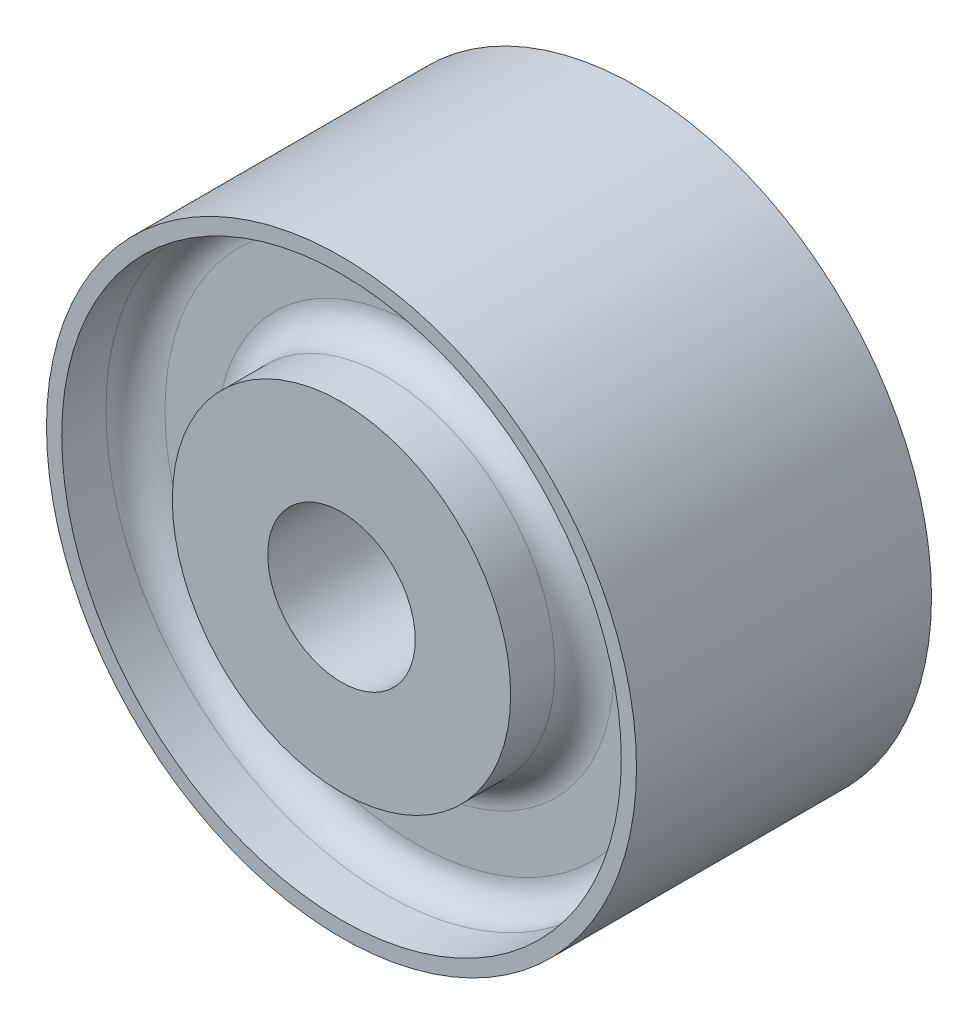
ISO-10303-21;
HEADER;
FILE_DESCRIPTION(('STEP AP214'),'2;1');
FILE_NAME('part.step','',(''),(''),'','','');
FILE_SCHEMA(('AUTOMOTIVE_DESIGN { 1 0 10303 214 1 1 1 1 }'));
ENDSEC;
DATA;
#1=APPLICATION_CONTEXT('core data for automotive mechanical design processes');
#2=APPLICATION_PROTOCOL_DEFINITION('international standard','automotive_design',2000,#1);
#3=PRODUCT_CONTEXT('',#1,'mechanical');
#4=PRODUCT('Part','Part','',(#3));
#5=PRODUCT_RELATED_PRODUCT_CATEGORY('part','',(#4));
#6=PRODUCT_DEFINITION_FORMATION('','',#4);
#7=PRODUCT_DEFINITION_CONTEXT('part definition',#1,'design');
#8=PRODUCT_DEFINITION('design','',#6,#7);
#9=PRODUCT_DEFINITION_SHAPE('','',#8);
#10=(LENGTH_UNIT() NAMED_UNIT(*) SI_UNIT(.MILLI.,.METRE.));
#11=(NAMED_UNIT(*) PLANE_ANGLE_UNIT() SI_UNIT($,.RADIAN.));
#12=(NAMED_UNIT(*) SI_UNIT($,.STERADIAN.) SOLID_ANGLE_UNIT());
#13=UNCERTAINTY_MEASURE_WITH_UNIT(LENGTH_MEASURE(1.E-05),#10,'distance_accuracy_value','');
#14=(GEOMETRIC_REPRESENTATION_CONTEXT(3) GLOBAL_UNCERTAINTY_ASSIGNED_CONTEXT((#13)) GLOBAL_UNIT_ASSIGNED_CONTEXT((#10,
#11,#12)) REPRESENTATION_CONTEXT('',''));
#15=CARTESIAN_POINT('',(0.,0.,0.));
#16=DIRECTION('',(0.,0.,1.));
#17=DIRECTION('',(1.,0.,0.));
#18=AXIS2_PLACEMENT_3D('',#15,#16,#17);
#19=CARTESIAN_POINT('',(0.,0.,-25.4));
#20=DIRECTION('',(0.,0.,1.));
#21=DIRECTION('',(1.,0.,0.));
#22=AXIS2_PLACEMENT_3D('',#19,#20,#21);
#23=PLANE('',#22);
#24=CARTESIAN_POINT('',(0.,0.,-25.4));
#25=DIRECTION('',(0.,0.,1.));
#26=DIRECTION('',(1.,0.,0.));
#27=AXIS2_PLACEMENT_3D('',#24,#25,#26);
#28=CIRCLE('',#27,50.8);
#29=CARTESIAN_POINT('',(50.8,0.,-25.4));
#30=VERTEX_POINT('',#29);
#31=EDGE_CURVE('E13',#30,#30,#28,.T.);
#32=ORIENTED_EDGE('',*,*,#31,.F.);
#33=EDGE_LOOP('',(#32));
#34=FACE_BOUND('',#33,.T.);
#35=CARTESIAN_POINT('',(0.,0.,-25.4));
#36=DIRECTION('',(0.,0.,1.));
#37=DIRECTION('',(0.,1.,0.));
#38=AXIS2_PLACEMENT_3D('',#35,#36,#37);
#39=CIRCLE('',#38,48.1770384947228);
#40=CARTESIAN_POINT('',(0.,48.1770384947228,-25.4));
#41=VERTEX_POINT('',#40);
#42=EDGE_CURVE('E106',#41,#41,#39,.T.);
#43=ORIENTED_EDGE('',*,*,#42,.T.);
#44=EDGE_LOOP('',(#43));
#45=FACE_BOUND('',#44,.T.);
#46=ADVANCED_FACE('F50',(#34,#45),#23,.F.);
#47=CARTESIAN_POINT('',(0.,0.,-25.4));
#48=DIRECTION('',(0.,0.,1.));
#49=DIRECTION('',(1.,0.,0.));
#50=AXIS2_PLACEMENT_3D('',#47,#48,#49);
#51=CIRCLE('',#50,12.7);
#52=CARTESIAN_POINT('',(12.7,0.,-25.4));
#53=VERTEX_POINT('',#52);
#54=EDGE_CURVE('E178',#53,#53,#51,.T.);
#55=ORIENTED_EDGE('',*,*,#54,.T.);
#56=EDGE_LOOP('',(#55));
#57=FACE_BOUND('',#56,.T.);
#58=CARTESIAN_POINT('',(0.,0.,-25.4));
#59=DIRECTION('',(0.,0.,1.));
#60=DIRECTION('',(0.,1.,0.));
#61=AXIS2_PLACEMENT_3D('',#58,#59,#60);
#62=CIRCLE('',#61,29.1270384947228);
#63=CARTESIAN_POINT('',(0.,29.1270384947228,-25.4));
#64=VERTEX_POINT('',#63);
#65=EDGE_CURVE('E115',#64,#64,#62,.T.);
#66=ORIENTED_EDGE('',*,*,#65,.F.);
#67=EDGE_LOOP('',(#66));
#68=FACE_BOUND('',#67,.T.);
#69=ADVANCED_FACE('F201',(#57,#68),#23,.F.);
#70=CARTESIAN_POINT('',(0.,0.,25.4));
#71=DIRECTION('',(0.,0.,1.));
#72=DIRECTION('',(1.,0.,0.));
#73=AXIS2_PLACEMENT_3D('',#70,#71,#72);
#74=PLANE('',#73);
#75=CARTESIAN_POINT('',(0.,0.,25.4));
#76=DIRECTION('',(0.,0.,1.));
#77=DIRECTION('',(0.,1.,0.));
#78=AXIS2_PLACEMENT_3D('',#75,#76,#77);
#79=CIRCLE('',#78,29.1270384947228);
#80=CARTESIAN_POINT('',(0.,29.1270384947228,25.4));
#81=VERTEX_POINT('',#80);
#82=EDGE_CURVE('E139',#81,#81,#79,.T.);
#83=ORIENTED_EDGE('',*,*,#82,.T.);
#84=EDGE_LOOP('',(#83));
#85=FACE_BOUND('',#84,.T.);
#86=CARTESIAN_POINT('',(0.,0.,25.4));
#87=DIRECTION('',(0.,0.,1.));
#88=DIRECTION('',(1.,0.,0.));
#89=AXIS2_PLACEMENT_3D('',#86,#87,#88);
#90=CIRCLE('',#89,12.7);
#91=CARTESIAN_POINT('',(12.7,0.,25.4));
#92=VERTEX_POINT('',#91);
#93=EDGE_CURVE('E175',#92,#92,#90,.T.);
#94=ORIENTED_EDGE('',*,*,#93,.F.);
#95=EDGE_LOOP('',(#94));
#96=FACE_BOUND('',#95,.T.);
#97=ADVANCED_FACE('F191',(#85,#96),#74,.T.);
#98=CARTESIAN_POINT('',(0.,0.,-25.4));
#99=DIRECTION('',(0.,0.,1.));
#100=DIRECTION('',(1.,0.,0.));
#101=AXIS2_PLACEMENT_3D('',#98,#99,#100);
#102=CYLINDRICAL_SURFACE('',#101,50.8);
#103=ORIENTED_EDGE('',*,*,#31,.T.);
#104=EDGE_LOOP('',(#103));
#105=FACE_BOUND('',#104,.T.);
#106=CARTESIAN_POINT('',(0.,0.,25.4));
#107=DIRECTION('',(0.,0.,1.));
#108=DIRECTION('',(1.,0.,0.));
#109=AXIS2_PLACEMENT_3D('',#106,#107,#108);
#110=CIRCLE('',#109,50.8);
#111=CARTESIAN_POINT('',(50.8,0.,25.4));
#112=VERTEX_POINT('',#111);
#113=EDGE_CURVE('E59',#112,#112,#110,.T.);
#114=ORIENTED_EDGE('',*,*,#113,.F.);
#115=EDGE_LOOP('',(#114));
#116=FACE_BOUND('',#115,.T.);
#117=ADVANCED_FACE('F52',(#105,#116),#102,.T.);
#118=CARTESIAN_POINT('',(0.,0.,25.4));
#119=DIRECTION('',(0.,0.,1.));
#120=DIRECTION('',(0.,1.,0.));
#121=AXIS2_PLACEMENT_3D('',#118,#119,#120);
#122=CIRCLE('',#121,48.1770384947228);
#123=CARTESIAN_POINT('',(0.,48.1770384947228,25.4));
#124=VERTEX_POINT('',#123);
#125=EDGE_CURVE('E144',#124,#124,#122,.T.);
#126=ORIENTED_EDGE('',*,*,#125,.F.);
#127=EDGE_LOOP('',(#126));
#128=FACE_BOUND('',#127,.T.);
#129=ORIENTED_EDGE('',*,*,#113,.T.);
#130=EDGE_LOOP('',(#129));
#131=FACE_BOUND('',#130,.T.);
#132=ADVANCED_FACE('F188',(#128,#131),#74,.T.);
#133=CARTESIAN_POINT('',(0.,0.,-25.4));
#134=DIRECTION('',(0.,0.,1.));
#135=DIRECTION('',(1.,0.,0.));
#136=AXIS2_PLACEMENT_3D('',#133,#134,#135);
#137=CYLINDRICAL_SURFACE('',#136,12.7);
#138=ORIENTED_EDGE('',*,*,#54,.F.);
#139=EDGE_LOOP('',(#138));
#140=FACE_BOUND('',#139,.T.);
#141=ORIENTED_EDGE('',*,*,#93,.T.);
#142=EDGE_LOOP('',(#141));
#143=FACE_BOUND('',#142,.T.);
#144=ADVANCED_FACE('F197',(#140,#143),#137,.F.);
#145=CARTESIAN_POINT('',(0.,0.,25.4));
#146=DIRECTION('',(0.,0.,1.));
#147=DIRECTION('',(1.,0.,0.));
#148=AXIS2_PLACEMENT_3D('',#145,#146,#147);
#149=CYLINDRICAL_SURFACE('',#148,29.1270384947228);
#150=DIRECTION('',(0.,0.,-1.));
#151=VECTOR('',#150,1.);
#152=CARTESIAN_POINT('',(0.,29.1270384947228,25.4));
#153=LINE('',#152,#151);
#154=CARTESIAN_POINT('',(0.,29.1270384947228,17.78));
#155=VERTEX_POINT('',#154);
#156=EDGE_CURVE('E136',#81,#155,#153,.T.);
#157=ORIENTED_EDGE('',*,*,#156,.F.);
#158=ORIENTED_EDGE('',*,*,#82,.F.);
#159=ORIENTED_EDGE('',*,*,#156,.T.);
#160=CARTESIAN_POINT('',(0.,0.,17.78));
#161=DIRECTION('',(0.,0.,1.));
#162=DIRECTION('',(0.,1.,0.));
#163=AXIS2_PLACEMENT_3D('',#160,#161,#162);
#164=CIRCLE('',#163,29.1270384947228);
#165=EDGE_CURVE('E143',#155,#155,#164,.T.);
#166=ORIENTED_EDGE('',*,*,#165,.T.);
#167=EDGE_LOOP('',(#157,#158,#159,#166));
#168=FACE_BOUND('',#167,.T.);
#169=ADVANCED_FACE('F215',(#168),#149,.T.);
#170=CARTESIAN_POINT('',(0.,0.,17.78));
#171=DIRECTION('',(0.,0.,1.));
#172=DIRECTION('',(1.,0.,0.));
#173=AXIS2_PLACEMENT_3D('',#170,#171,#172);
#174=TOROIDAL_SURFACE('',#173,34.2070384947228,5.08);
#175=CARTESIAN_POINT('',(0.,34.2070384947228,17.78));
#176=DIRECTION('',(1.,0.,0.));
#177=DIRECTION('',(0.,0.,1.));
#178=AXIS2_PLACEMENT_3D('',#175,#176,#177);
#179=CIRCLE('',#178,5.08);
#180=CARTESIAN_POINT('',(0.,34.2070384947228,12.7));
#181=VERTEX_POINT('',#180);
#182=EDGE_CURVE('E151',#155,#181,#179,.T.);
#183=ORIENTED_EDGE('',*,*,#182,.F.);
#184=ORIENTED_EDGE('',*,*,#165,.F.);
#185=ORIENTED_EDGE('',*,*,#182,.T.);
#186=CARTESIAN_POINT('',(0.,0.,12.7));
#187=DIRECTION('',(0.,0.,1.));
#188=DIRECTION('',(0.,1.,0.));
#189=AXIS2_PLACEMENT_3D('',#186,#187,#188);
#190=CIRCLE('',#189,34.2070384947228);
#191=EDGE_CURVE('E155',#181,#181,#190,.T.);
#192=ORIENTED_EDGE('',*,*,#191,.T.);
#193=EDGE_LOOP('',(#183,#184,#185,#192));
#194=FACE_BOUND('',#193,.T.);
#195=ADVANCED_FACE('F228',(#194),#174,.F.);
#196=CARTESIAN_POINT('',(0.,43.0970384947228,12.7));
#197=DIRECTION('',(0.,0.,1.));
#198=DIRECTION('',(1.,0.,0.));
#199=AXIS2_PLACEMENT_3D('',#196,#197,#198);
#200=PLANE('',#199);
#201=CARTESIAN_POINT('',(0.,0.,12.7));
#202=DIRECTION('',(0.,0.,1.));
#203=DIRECTION('',(0.,1.,0.));
#204=AXIS2_PLACEMENT_3D('',#201,#202,#203);
#205=CIRCLE('',#204,43.0970384947228);
#206=CARTESIAN_POINT('',(0.,43.0970384947228,12.7));
#207=VERTEX_POINT('',#206);
#208=EDGE_CURVE('E162',#207,#207,#205,.T.);
#209=ORIENTED_EDGE('',*,*,#208,.T.);
#210=EDGE_LOOP('',(#209));
#211=FACE_BOUND('',#210,.T.);
#212=ORIENTED_EDGE('',*,*,#191,.F.);
#213=EDGE_LOOP('',(#212));
#214=FACE_BOUND('',#213,.T.);
#215=ADVANCED_FACE('F224',(#211,#214),#200,.T.);
#216=CARTESIAN_POINT('',(0.,0.,17.78));
#217=DIRECTION('',(0.,0.,1.));
#218=DIRECTION('',(1.,0.,0.));
#219=AXIS2_PLACEMENT_3D('',#216,#217,#218);
#220=TOROIDAL_SURFACE('',#219,43.0970384947228,5.08);
#221=CARTESIAN_POINT('',(0.,43.0970384947228,17.78));
#222=DIRECTION('',(1.,0.,0.));
#223=DIRECTION('',(0.,0.,-1.));
#224=AXIS2_PLACEMENT_3D('',#221,#222,#223);
#225=CIRCLE('',#224,5.08);
#226=CARTESIAN_POINT('',(0.,48.1770384947228,17.78));
#227=VERTEX_POINT('',#226);
#228=EDGE_CURVE('E165',#207,#227,#225,.T.);
#229=ORIENTED_EDGE('',*,*,#228,.F.);
#230=ORIENTED_EDGE('',*,*,#208,.F.);
#231=ORIENTED_EDGE('',*,*,#228,.T.);
#232=CARTESIAN_POINT('',(0.,0.,17.78));
#233=DIRECTION('',(0.,0.,1.));
#234=DIRECTION('',(0.,1.,0.));
#235=AXIS2_PLACEMENT_3D('',#232,#233,#234);
#236=CIRCLE('',#235,48.1770384947228);
#237=EDGE_CURVE('E169',#227,#227,#236,.T.);
#238=ORIENTED_EDGE('',*,*,#237,.T.);
#239=EDGE_LOOP('',(#229,#230,#231,#238));
#240=FACE_BOUND('',#239,.T.);
#241=ADVANCED_FACE('F220',(#240),#220,.F.);
#242=CARTESIAN_POINT('',(0.,0.,25.4));
#243=DIRECTION('',(0.,0.,1.));
#244=DIRECTION('',(1.,0.,0.));
#245=AXIS2_PLACEMENT_3D('',#242,#243,#244);
#246=CYLINDRICAL_SURFACE('',#245,48.1770384947228);
#247=DIRECTION('',(0.,0.,1.));
#248=VECTOR('',#247,1.);
#249=CARTESIAN_POINT('',(0.,48.1770384947228,25.4));
#250=LINE('',#249,#248);
#251=EDGE_CURVE('E148',#227,#124,#250,.T.);
#252=ORIENTED_EDGE('',*,*,#251,.F.);
#253=ORIENTED_EDGE('',*,*,#237,.F.);
#254=ORIENTED_EDGE('',*,*,#251,.T.);
#255=ORIENTED_EDGE('',*,*,#125,.T.);
#256=EDGE_LOOP('',(#252,#253,#254,#255));
#257=FACE_BOUND('',#256,.T.);
#258=ADVANCED_FACE('F217',(#257),#246,.F.);
#259=CARTESIAN_POINT('',(0.,0.,-25.4));
#260=DIRECTION('',(0.,0.,1.));
#261=DIRECTION('',(1.,0.,0.));
#262=AXIS2_PLACEMENT_3D('',#259,#260,#261);
#263=CYLINDRICAL_SURFACE('',#262,48.1770384947228);
#264=DIRECTION('',(0.,0.,-1.));
#265=VECTOR('',#264,1.);
#266=CARTESIAN_POINT('',(0.,48.1770384947228,-25.4));
#267=LINE('',#266,#265);
#268=CARTESIAN_POINT('',(0.,48.1770384947228,-17.78));
#269=VERTEX_POINT('',#268);
#270=EDGE_CURVE('E66',#41,#269,#267,.F.);
#271=ORIENTED_EDGE('',*,*,#270,.F.);
#272=ORIENTED_EDGE('',*,*,#42,.F.);
#273=ORIENTED_EDGE('',*,*,#270,.T.);
#274=CARTESIAN_POINT('',(0.,0.,-17.78));
#275=DIRECTION('',(0.,0.,1.));
#276=DIRECTION('',(0.,1.,0.));
#277=AXIS2_PLACEMENT_3D('',#274,#275,#276);
#278=CIRCLE('',#277,48.1770384947228);
#279=EDGE_CURVE('E104',#269,#269,#278,.T.);
#280=ORIENTED_EDGE('',*,*,#279,.T.);
#281=EDGE_LOOP('',(#271,#272,#273,#280));
#282=FACE_BOUND('',#281,.T.);
#283=ADVANCED_FACE('F102',(#282),#263,.F.);
#284=CARTESIAN_POINT('',(0.,0.,-17.78));
#285=DIRECTION('',(0.,0.,1.));
#286=DIRECTION('',(1.,0.,0.));
#287=AXIS2_PLACEMENT_3D('',#284,#285,#286);
#288=TOROIDAL_SURFACE('',#287,43.0970384947228,5.08);
#289=CARTESIAN_POINT('',(0.,43.0970384947228,-17.78));
#290=DIRECTION('',(-1.,0.,0.));
#291=DIRECTION('',(0.,0.,1.));
#292=AXIS2_PLACEMENT_3D('',#289,#290,#291);
#293=CIRCLE('',#292,5.08);
#294=CARTESIAN_POINT('',(0.,43.0970384947228,-12.7));
#295=VERTEX_POINT('',#294);
#296=EDGE_CURVE('E108',#269,#295,#293,.F.);
#297=ORIENTED_EDGE('',*,*,#296,.F.);
#298=ORIENTED_EDGE('',*,*,#279,.F.);
#299=ORIENTED_EDGE('',*,*,#296,.T.);
#300=CARTESIAN_POINT('',(0.,0.,-12.7));
#301=DIRECTION('',(0.,0.,1.));
#302=DIRECTION('',(0.,1.,0.));
#303=AXIS2_PLACEMENT_3D('',#300,#301,#302);
#304=CIRCLE('',#303,43.0970384947228);
#305=EDGE_CURVE('E118',#295,#295,#304,.T.);
#306=ORIENTED_EDGE('',*,*,#305,.T.);
#307=EDGE_LOOP('',(#297,#298,#299,#306));
#308=FACE_BOUND('',#307,.T.);
#309=ADVANCED_FACE('F246',(#308),#288,.F.);
#310=CARTESIAN_POINT('',(0.,43.0970384947228,-12.7));
#311=DIRECTION('',(0.,0.,-1.));
#312=DIRECTION('',(-1.,0.,0.));
#313=AXIS2_PLACEMENT_3D('',#310,#311,#312);
#314=PLANE('',#313);
#315=CARTESIAN_POINT('',(0.,0.,-12.7));
#316=DIRECTION('',(0.,0.,1.));
#317=DIRECTION('',(0.,1.,0.));
#318=AXIS2_PLACEMENT_3D('',#315,#316,#317);
#319=CIRCLE('',#318,34.2070384947228);
#320=CARTESIAN_POINT('',(0.,34.2070384947228,-12.7));
#321=VERTEX_POINT('',#320);
#322=EDGE_CURVE('E123',#321,#321,#319,.T.);
#323=ORIENTED_EDGE('',*,*,#322,.T.);
#324=EDGE_LOOP('',(#323));
#325=FACE_BOUND('',#324,.T.);
#326=ORIENTED_EDGE('',*,*,#305,.F.);
#327=EDGE_LOOP('',(#326));
#328=FACE_BOUND('',#327,.T.);
#329=ADVANCED_FACE('F242',(#325,#328),#314,.T.);
#330=CARTESIAN_POINT('',(0.,0.,-17.78));
#331=DIRECTION('',(0.,0.,1.));
#332=DIRECTION('',(1.,0.,0.));
#333=AXIS2_PLACEMENT_3D('',#330,#331,#332);
#334=TOROIDAL_SURFACE('',#333,34.2070384947228,5.08);
#335=CARTESIAN_POINT('',(0.,34.2070384947228,-17.78));
#336=DIRECTION('',(-1.,0.,0.));
#337=DIRECTION('',(0.,0.,-1.));
#338=AXIS2_PLACEMENT_3D('',#335,#336,#337);
#339=CIRCLE('',#338,5.08);
#340=CARTESIAN_POINT('',(0.,29.1270384947228,-17.78));
#341=VERTEX_POINT('',#340);
#342=EDGE_CURVE('E126',#321,#341,#339,.F.);
#343=ORIENTED_EDGE('',*,*,#342,.F.);
#344=ORIENTED_EDGE('',*,*,#322,.F.);
#345=ORIENTED_EDGE('',*,*,#342,.T.);
#346=CARTESIAN_POINT('',(0.,0.,-17.78));
#347=DIRECTION('',(0.,0.,1.));
#348=DIRECTION('',(0.,1.,0.));
#349=AXIS2_PLACEMENT_3D('',#346,#347,#348);
#350=CIRCLE('',#349,29.1270384947228);
#351=EDGE_CURVE('E130',#341,#341,#350,.T.);
#352=ORIENTED_EDGE('',*,*,#351,.T.);
#353=EDGE_LOOP('',(#343,#344,#345,#352));
#354=FACE_BOUND('',#353,.T.);
#355=ADVANCED_FACE('F239',(#354),#334,.F.);
#356=CARTESIAN_POINT('',(0.,0.,-25.4));
#357=DIRECTION('',(0.,0.,1.));
#358=DIRECTION('',(1.,0.,0.));
#359=AXIS2_PLACEMENT_3D('',#356,#357,#358);
#360=CYLINDRICAL_SURFACE('',#359,29.1270384947228);
#361=DIRECTION('',(0.,0.,1.));
#362=VECTOR('',#361,1.);
#363=CARTESIAN_POINT('',(0.,29.1270384947228,-25.4));
#364=LINE('',#363,#362);
#365=EDGE_CURVE('E73',#341,#64,#364,.F.);
#366=ORIENTED_EDGE('',*,*,#365,.F.);
#367=ORIENTED_EDGE('',*,*,#351,.F.);
#368=ORIENTED_EDGE('',*,*,#365,.T.);
#369=ORIENTED_EDGE('',*,*,#65,.T.);
#370=EDGE_LOOP('',(#366,#367,#368,#369));
#371=FACE_BOUND('',#370,.T.);
#372=ADVANCED_FACE('F236',(#371),#360,.T.);
#373=CLOSED_SHELL('',(#46,#69,#97,#117,#132,#144,#169,#195,#215,#241,#258,#283,#309,#329,#355,#372));
#374=MANIFOLD_SOLID_BREP('B2',#373);
#375=ADVANCED_BREP_SHAPE_REPRESENTATION('',(#18,#374),#14);
#376=SHAPE_DEFINITION_REPRESENTATION(#9,#375);
ENDSEC;
END-ISO-10303-21;
